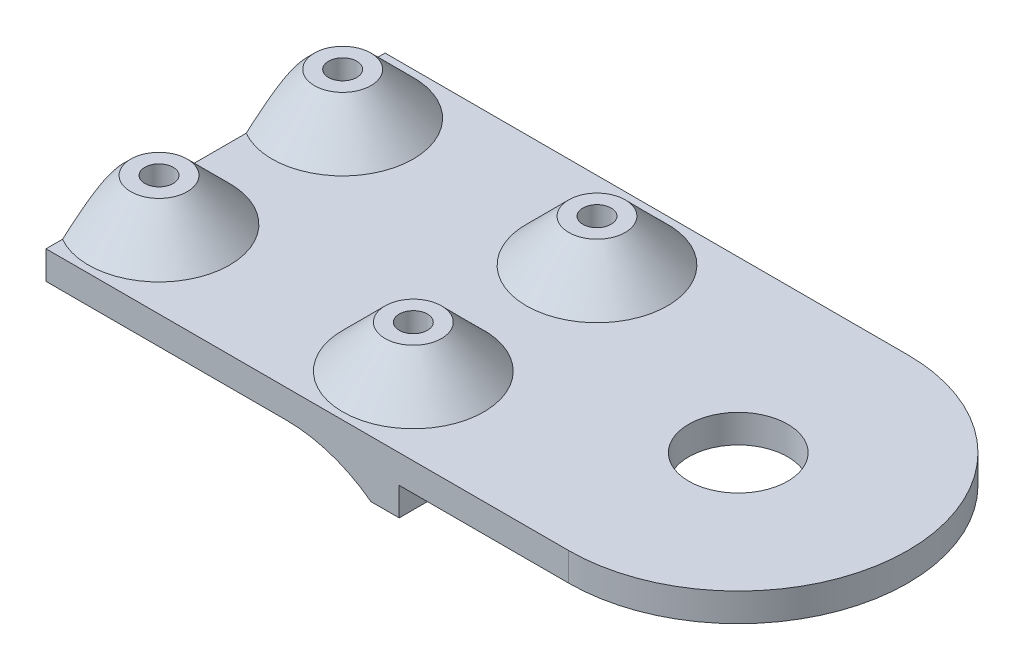
ISO-10303-21;
HEADER;
FILE_DESCRIPTION(('STEP AP214'),'2;1');
FILE_NAME('part.step','',(''),(''),'','','');
FILE_SCHEMA(('AUTOMOTIVE_DESIGN { 1 0 10303 214 1 1 1 1 }'));
ENDSEC;
DATA;
#1=APPLICATION_CONTEXT('core data for automotive mechanical design processes');
#2=APPLICATION_PROTOCOL_DEFINITION('international standard','automotive_design',2000,#1);
#3=PRODUCT_CONTEXT('',#1,'mechanical');
#4=PRODUCT('Part','Part','',(#3));
#5=PRODUCT_RELATED_PRODUCT_CATEGORY('part','',(#4));
#6=PRODUCT_DEFINITION_FORMATION('','',#4);
#7=PRODUCT_DEFINITION_CONTEXT('part definition',#1,'design');
#8=PRODUCT_DEFINITION('design','',#6,#7);
#9=PRODUCT_DEFINITION_SHAPE('','',#8);
#10=(LENGTH_UNIT() NAMED_UNIT(*) SI_UNIT(.MILLI.,.METRE.));
#11=(NAMED_UNIT(*) PLANE_ANGLE_UNIT() SI_UNIT($,.RADIAN.));
#12=(NAMED_UNIT(*) SI_UNIT($,.STERADIAN.) SOLID_ANGLE_UNIT());
#13=UNCERTAINTY_MEASURE_WITH_UNIT(LENGTH_MEASURE(1.E-05),#10,'distance_accuracy_value','');
#14=(GEOMETRIC_REPRESENTATION_CONTEXT(3) GLOBAL_UNCERTAINTY_ASSIGNED_CONTEXT((#13)) GLOBAL_UNIT_ASSIGNED_CONTEXT((#10,
#11,#12)) REPRESENTATION_CONTEXT('',''));
#15=CARTESIAN_POINT('',(0.,0.,0.));
#16=DIRECTION('',(0.,0.,1.));
#17=DIRECTION('',(1.,0.,0.));
#18=AXIS2_PLACEMENT_3D('',#15,#16,#17);
#19=CARTESIAN_POINT('',(0.,0.,0.));
#20=DIRECTION('',(0.,1.,0.));
#21=DIRECTION('',(0.,0.,1.));
#22=AXIS2_PLACEMENT_3D('',#19,#20,#21);
#23=PLANE('',#22);
#24=CARTESIAN_POINT('',(37.,0.,-12.));
#25=DIRECTION('',(0.,1.,0.));
#26=DIRECTION('',(0.,0.,1.));
#27=AXIS2_PLACEMENT_3D('',#24,#25,#26);
#28=CIRCLE('',#27,3.5);
#29=CARTESIAN_POINT('',(37.,0.,-8.5));
#30=VERTEX_POINT('',#29);
#31=EDGE_CURVE('E184',#30,#30,#28,.T.);
#32=ORIENTED_EDGE('',*,*,#31,.T.);
#33=EDGE_LOOP('',(#32));
#34=FACE_BOUND('',#33,.T.);
#35=DIRECTION('',(0.,0.,1.));
#36=VECTOR('',#35,1.);
#37=CARTESIAN_POINT('',(25.,0.,0.));
#38=LINE('',#37,#36);
#39=CARTESIAN_POINT('',(25.,0.,-24.));
#40=VERTEX_POINT('',#39);
#41=CARTESIAN_POINT('',(25.,0.,0.));
#42=VERTEX_POINT('',#41);
#43=EDGE_CURVE('E141',#40,#42,#38,.T.);
#44=ORIENTED_EDGE('',*,*,#43,.F.);
#45=DIRECTION('',(1.,0.,0.));
#46=VECTOR('',#45,1.);
#47=CARTESIAN_POINT('',(0.,0.,-24.));
#48=LINE('',#47,#46);
#49=CARTESIAN_POINT('',(37.,0.,-24.));
#50=VERTEX_POINT('',#49);
#51=EDGE_CURVE('E132',#40,#50,#48,.T.);
#52=ORIENTED_EDGE('',*,*,#51,.T.);
#53=CARTESIAN_POINT('',(37.,0.,-12.));
#54=DIRECTION('',(0.,1.,0.));
#55=DIRECTION('',(0.,0.,1.));
#56=AXIS2_PLACEMENT_3D('',#53,#54,#55);
#57=CIRCLE('',#56,12.);
#58=CARTESIAN_POINT('',(37.,0.,0.));
#59=VERTEX_POINT('',#58);
#60=EDGE_CURVE('E200',#59,#50,#57,.T.);
#61=ORIENTED_EDGE('',*,*,#60,.F.);
#62=DIRECTION('',(1.,0.,0.));
#63=VECTOR('',#62,1.);
#64=CARTESIAN_POINT('',(0.,0.,0.));
#65=LINE('',#64,#63);
#66=EDGE_CURVE('E179',#42,#59,#65,.T.);
#67=ORIENTED_EDGE('',*,*,#66,.F.);
#68=EDGE_LOOP('',(#44,#52,#61,#67));
#69=FACE_BOUND('',#68,.T.);
#70=ADVANCED_FACE('F35',(#34,#69),#23,.F.);
#71=CARTESIAN_POINT('',(2.5,0.,-5.5));
#72=DIRECTION('',(0.,1.,0.));
#73=DIRECTION('',(0.,0.,1.));
#74=AXIS2_PLACEMENT_3D('',#71,#72,#73);
#75=CIRCLE('',#74,1.);
#76=CARTESIAN_POINT('',(2.5,0.,-4.5));
#77=VERTEX_POINT('',#76);
#78=EDGE_CURVE('E154',#77,#77,#75,.T.);
#79=ORIENTED_EDGE('',*,*,#78,.T.);
#80=EDGE_LOOP('',(#79));
#81=FACE_BOUND('',#80,.T.);
#82=CARTESIAN_POINT('',(2.5,0.,-18.5));
#83=DIRECTION('',(0.,1.,0.));
#84=DIRECTION('',(0.,0.,1.));
#85=AXIS2_PLACEMENT_3D('',#82,#83,#84);
#86=CIRCLE('',#85,1.);
#87=CARTESIAN_POINT('',(2.5,0.,-17.5));
#88=VERTEX_POINT('',#87);
#89=EDGE_CURVE('E161',#88,#88,#86,.T.);
#90=ORIENTED_EDGE('',*,*,#89,.T.);
#91=EDGE_LOOP('',(#90));
#92=FACE_BOUND('',#91,.T.);
#93=CARTESIAN_POINT('',(0.,0.,-24.));
#94=VERTEX_POINT('',#93);
#95=CARTESIAN_POINT('',(17.,0.,-24.));
#96=VERTEX_POINT('',#95);
#97=EDGE_CURVE('E203',#94,#96,#48,.T.);
#98=ORIENTED_EDGE('',*,*,#97,.T.);
#99=DIRECTION('',(0.,0.,1.));
#100=VECTOR('',#99,1.);
#101=CARTESIAN_POINT('',(17.,0.,0.));
#102=LINE('',#101,#100);
#103=CARTESIAN_POINT('',(17.,0.,0.));
#104=VERTEX_POINT('',#103);
#105=EDGE_CURVE('E62',#96,#104,#102,.T.);
#106=ORIENTED_EDGE('',*,*,#105,.T.);
#107=CARTESIAN_POINT('',(0.,0.,0.));
#108=VERTEX_POINT('',#107);
#109=EDGE_CURVE('E198',#108,#104,#65,.T.);
#110=ORIENTED_EDGE('',*,*,#109,.F.);
#111=DIRECTION('',(0.,0.,-1.));
#112=VECTOR('',#111,1.);
#113=CARTESIAN_POINT('',(0.,0.,0.));
#114=LINE('',#113,#112);
#115=EDGE_CURVE('E205',#108,#94,#114,.T.);
#116=ORIENTED_EDGE('',*,*,#115,.T.);
#117=EDGE_LOOP('',(#98,#106,#110,#116));
#118=FACE_BOUND('',#117,.T.);
#119=ADVANCED_FACE('F263',(#81,#92,#118),#23,.F.);
#120=CARTESIAN_POINT('',(0.,2.,0.));
#121=DIRECTION('',(0.,0.,-1.));
#122=DIRECTION('',(-1.,0.,0.));
#123=AXIS2_PLACEMENT_3D('',#120,#121,#122);
#124=PLANE('',#123);
#125=ORIENTED_EDGE('',*,*,#109,.T.);
#126=CARTESIAN_POINT('',(17.,-10.,0.));
#127=DIRECTION('',(0.,0.,-1.));
#128=DIRECTION('',(-1.,0.,0.));
#129=AXIS2_PLACEMENT_3D('',#126,#127,#128);
#130=CIRCLE('',#129,10.);
#131=CARTESIAN_POINT('',(23.,-2.,0.));
#132=VERTEX_POINT('',#131);
#133=EDGE_CURVE('E11',#104,#132,#130,.T.);
#134=ORIENTED_EDGE('',*,*,#133,.T.);
#135=DIRECTION('',(1.,0.,0.));
#136=VECTOR('',#135,1.);
#137=CARTESIAN_POINT('',(0.,-2.,0.));
#138=LINE('',#137,#136);
#139=CARTESIAN_POINT('',(25.,-2.,0.));
#140=VERTEX_POINT('',#139);
#141=EDGE_CURVE('E136',#132,#140,#138,.T.);
#142=ORIENTED_EDGE('',*,*,#141,.T.);
#143=DIRECTION('',(0.,1.,0.));
#144=VECTOR('',#143,1.);
#145=CARTESIAN_POINT('',(25.,-2.,0.));
#146=LINE('',#145,#144);
#147=EDGE_CURVE('E135',#140,#42,#146,.T.);
#148=ORIENTED_EDGE('',*,*,#147,.T.);
#149=ORIENTED_EDGE('',*,*,#66,.T.);
#150=DIRECTION('',(0.,-1.,0.));
#151=VECTOR('',#150,1.);
#152=CARTESIAN_POINT('',(37.,2.,0.));
#153=LINE('',#152,#151);
#154=CARTESIAN_POINT('',(37.,2.,0.));
#155=VERTEX_POINT('',#154);
#156=EDGE_CURVE('E215',#155,#59,#153,.T.);
#157=ORIENTED_EDGE('',*,*,#156,.F.);
#158=DIRECTION('',(1.,0.,0.));
#159=VECTOR('',#158,1.);
#160=CARTESIAN_POINT('',(0.,2.,0.));
#161=LINE('',#160,#159);
#162=CARTESIAN_POINT('',(0.,2.,0.));
#163=VERTEX_POINT('',#162);
#164=EDGE_CURVE('E180',#163,#155,#161,.T.);
#165=ORIENTED_EDGE('',*,*,#164,.F.);
#166=DIRECTION('',(0.,-1.,0.));
#167=VECTOR('',#166,1.);
#168=CARTESIAN_POINT('',(0.,2.,0.));
#169=LINE('',#168,#167);
#170=EDGE_CURVE('E197',#163,#108,#169,.T.);
#171=ORIENTED_EDGE('',*,*,#170,.T.);
#172=EDGE_LOOP('',(#125,#134,#142,#148,#149,#157,#165,#171));
#173=FACE_BOUND('',#172,.T.);
#174=ADVANCED_FACE('F259',(#173),#124,.F.);
#175=CARTESIAN_POINT('',(37.,2.,-12.));
#176=DIRECTION('',(0.,-1.,0.));
#177=DIRECTION('',(0.,0.,-1.));
#178=AXIS2_PLACEMENT_3D('',#175,#176,#177);
#179=CYLINDRICAL_SURFACE('',#178,12.);
#180=ORIENTED_EDGE('',*,*,#60,.T.);
#181=DIRECTION('',(0.,-1.,0.));
#182=VECTOR('',#181,1.);
#183=CARTESIAN_POINT('',(37.,2.,-24.));
#184=LINE('',#183,#182);
#185=CARTESIAN_POINT('',(37.,2.,-24.));
#186=VERTEX_POINT('',#185);
#187=EDGE_CURVE('E213',#186,#50,#184,.T.);
#188=ORIENTED_EDGE('',*,*,#187,.F.);
#189=CARTESIAN_POINT('',(37.,2.,-12.));
#190=DIRECTION('',(0.,1.,0.));
#191=DIRECTION('',(0.,0.,1.));
#192=AXIS2_PLACEMENT_3D('',#189,#190,#191);
#193=CIRCLE('',#192,12.);
#194=EDGE_CURVE('E183',#155,#186,#193,.T.);
#195=ORIENTED_EDGE('',*,*,#194,.F.);
#196=ORIENTED_EDGE('',*,*,#156,.T.);
#197=EDGE_LOOP('',(#180,#188,#195,#196));
#198=FACE_BOUND('',#197,.T.);
#199=ADVANCED_FACE('F256',(#198),#179,.T.);
#200=CARTESIAN_POINT('',(0.,2.,-24.));
#201=DIRECTION('',(0.,0.,-1.));
#202=DIRECTION('',(-1.,0.,0.));
#203=AXIS2_PLACEMENT_3D('',#200,#201,#202);
#204=PLANE('',#203);
#205=ORIENTED_EDGE('',*,*,#97,.F.);
#206=DIRECTION('',(0.,-1.,0.));
#207=VECTOR('',#206,1.);
#208=CARTESIAN_POINT('',(0.,2.,-24.));
#209=LINE('',#208,#207);
#210=CARTESIAN_POINT('',(0.,2.,-24.));
#211=VERTEX_POINT('',#210);
#212=EDGE_CURVE('E211',#211,#94,#209,.T.);
#213=ORIENTED_EDGE('',*,*,#212,.F.);
#214=DIRECTION('',(1.,0.,0.));
#215=VECTOR('',#214,1.);
#216=CARTESIAN_POINT('',(0.,2.,-24.));
#217=LINE('',#216,#215);
#218=EDGE_CURVE('E186',#211,#186,#217,.T.);
#219=ORIENTED_EDGE('',*,*,#218,.T.);
#220=ORIENTED_EDGE('',*,*,#187,.T.);
#221=ORIENTED_EDGE('',*,*,#51,.F.);
#222=DIRECTION('',(0.,1.,0.));
#223=VECTOR('',#222,1.);
#224=CARTESIAN_POINT('',(25.,-2.,-24.));
#225=LINE('',#224,#223);
#226=CARTESIAN_POINT('',(25.,-2.,-24.));
#227=VERTEX_POINT('',#226);
#228=EDGE_CURVE('E129',#227,#40,#225,.T.);
#229=ORIENTED_EDGE('',*,*,#228,.F.);
#230=DIRECTION('',(1.,0.,0.));
#231=VECTOR('',#230,1.);
#232=CARTESIAN_POINT('',(0.,-2.,-24.));
#233=LINE('',#232,#231);
#234=CARTESIAN_POINT('',(23.,-2.,-24.));
#235=VERTEX_POINT('',#234);
#236=EDGE_CURVE('E117',#235,#227,#233,.T.);
#237=ORIENTED_EDGE('',*,*,#236,.F.);
#238=CARTESIAN_POINT('',(17.,-10.,-24.));
#239=DIRECTION('',(0.,0.,-1.));
#240=DIRECTION('',(-1.,0.,0.));
#241=AXIS2_PLACEMENT_3D('',#238,#239,#240);
#242=CIRCLE('',#241,10.);
#243=EDGE_CURVE('E48',#235,#96,#242,.F.);
#244=ORIENTED_EDGE('',*,*,#243,.T.);
#245=EDGE_LOOP('',(#205,#213,#219,#220,#221,#229,#237,#244));
#246=FACE_BOUND('',#245,.T.);
#247=ADVANCED_FACE('F130',(#246),#204,.T.);
#248=CARTESIAN_POINT('',(0.,2.,0.));
#249=DIRECTION('',(-1.,0.,0.));
#250=DIRECTION('',(0.,0.,1.));
#251=AXIS2_PLACEMENT_3D('',#248,#249,#250);
#252=PLANE('',#251);
#253=ORIENTED_EDGE('',*,*,#115,.F.);
#254=ORIENTED_EDGE('',*,*,#170,.F.);
#255=DIRECTION('',(0.,0.,-1.));
#256=VECTOR('',#255,1.);
#257=CARTESIAN_POINT('',(0.,2.,0.));
#258=LINE('',#257,#256);
#259=CARTESIAN_POINT('',(0.,2.,-1.16987298107782));
#260=VERTEX_POINT('',#259);
#261=EDGE_CURVE('E190',#163,#260,#258,.T.);
#262=ORIENTED_EDGE('',*,*,#261,.T.);
#263=CARTESIAN_POINT('',(0.,2.,-1.16987298107782));
#264=CARTESIAN_POINT('',(0.,2.11102028561748,-1.29811896667083));
#265=CARTESIAN_POINT('',(0.,2.22138964449108,-1.42694043064441));
#266=CARTESIAN_POINT('',(0.,2.44036248190678,-1.68617973891037));
#267=CARTESIAN_POINT('',(0.,2.54896508599943,-1.81659832088444));
#268=CARTESIAN_POINT('',(0.,2.76635278332313,-2.08243653223856));
#269=CARTESIAN_POINT('',(0.,2.87508239787838,-2.21790171021895));
#270=CARTESIAN_POINT('',(0.,3.08919780990352,-2.49140734337877));
#271=CARTESIAN_POINT('',(0.,3.19458444119692,-2.6294471425238));
#272=CARTESIAN_POINT('',(0.,3.40089119784645,-2.909144515227));
#273=CARTESIAN_POINT('',(0.,3.50180489898433,-3.05080685904445));
#274=CARTESIAN_POINT('',(0.,3.69705465616297,-3.3388231556635));
#275=CARTESIAN_POINT('',(0.,3.79138529437451,-3.48518083142675));
#276=CARTESIAN_POINT('',(0.,3.96935859054866,-3.78275310980562));
#277=CARTESIAN_POINT('',(0.,4.0530804150461,-3.93391972527803));
#278=CARTESIAN_POINT('',(0.,4.20533486796254,-4.2437062238995));
#279=CARTESIAN_POINT('',(0.,4.27389569332966,-4.40231159450449));
#280=CARTESIAN_POINT('',(0.,4.3600347555185,-4.64825485294383));
#281=CARTESIAN_POINT('',(0.,4.38616221249707,-4.73258498035122));
#282=CARTESIAN_POINT('',(0.,4.43107085398967,-4.9032034930822));
#283=CARTESIAN_POINT('',(0.,4.44985321239967,-4.98949156315259));
#284=CARTESIAN_POINT('',(0.,4.47882728150846,-5.1629932917334));
#285=CARTESIAN_POINT('',(0.,4.48906979592931,-5.25019830534053));
#286=CARTESIAN_POINT('',(0.,4.50040506767032,-5.42520634082983));
#287=CARTESIAN_POINT('',(0.,4.50149870727723,-5.51300930423039));
#288=CARTESIAN_POINT('',(0.,4.49444971956765,-5.68831669792562));
#289=CARTESIAN_POINT('',(0.,4.48629853638581,-5.77582077638265));
#290=CARTESIAN_POINT('',(0.,4.46135496560027,-5.94957920981623));
#291=CARTESIAN_POINT('',(0.,4.44456091030227,-6.03583332030022));
#292=CARTESIAN_POINT('',(0.,4.40327077533189,-6.20708212278415));
#293=CARTESIAN_POINT('',(0.,4.3787218150578,-6.29206384192981));
#294=CARTESIAN_POINT('',(0.,4.32323053630725,-6.45988047510072));
#295=CARTESIAN_POINT('',(0.,4.29228818622622,-6.54271537851131));
#296=CARTESIAN_POINT('',(0.,4.21730185412421,-6.72552506872367));
#297=CARTESIAN_POINT('',(0.,4.17188908182162,-6.82493378735351));
#298=CARTESIAN_POINT('',(0.,4.07501498236769,-7.02078454937138));
#299=CARTESIAN_POINT('',(0.,4.02355013559929,-7.11722482490347));
#300=CARTESIAN_POINT('',(0.,3.9159189083616,-7.30768911371251));
#301=CARTESIAN_POINT('',(0.,3.85974294629128,-7.40170766818144));
#302=CARTESIAN_POINT('',(0.,3.74386597285785,-7.58750514409051));
#303=CARTESIAN_POINT('',(0.,3.68416566836026,-7.67928450945359));
#304=CARTESIAN_POINT('',(0.,3.56169555881191,-7.86146330213527));
#305=CARTESIAN_POINT('',(0.,3.49891129228361,-7.95185296269885));
#306=CARTESIAN_POINT('',(0.,3.37114498929469,-8.13106917191764));
#307=CARTESIAN_POINT('',(0.,3.30616278739215,-8.21989560213764));
#308=CARTESIAN_POINT('',(0.,3.10876538092659,-8.48420956576962));
#309=CARTESIAN_POINT('',(0.,2.9737482833352,-8.65775166574288));
#310=CARTESIAN_POINT('',(0.,2.6999574315782,-9.00011418577498));
#311=CARTESIAN_POINT('',(0.,2.56121091552945,-9.1689566084475));
#312=CARTESIAN_POINT('',(0.,2.35143188412874,-9.41933882445618));
#313=CARTESIAN_POINT('',(0.,2.28160219893462,-9.50189066161007));
#314=CARTESIAN_POINT('',(0.,2.14127527268499,-9.66641858358468));
#315=CARTESIAN_POINT('',(0.,2.07077806295171,-9.74839469510887));
#316=CARTESIAN_POINT('',(0.,2.,-9.83012701892218));
#317=B_SPLINE_CURVE_WITH_KNOTS('',3,(#263,#264,#265,#266,#267,#268,#269,#270,#271,#272,#273,
#274,#275,#276,#277,#278,#279,#280,#281,#282,#283,#284,#285,#286,#287,#288,#289,#290,#291,#292,
#293,#294,#295,#296,#297,#298,#299,#300,#301,#302,#303,#304,#305,#306,#307,#308,#309,#310,#311,
#312,#313,#314,#315,#316),.UNSPECIFIED.,.F.,.F.,(4,2,2,2,2,2,2,2,2,2,2,2,2,2,2,2,2,2,2,2,2,2,2,
2,2,2,4),(0.,0.508885434217438,1.01801551343181,1.53908854922306,2.06003057777813,
2.58169804635765,3.10378990164052,3.62172208893059,4.13868275156297,4.4032714931494,
4.66781793078105,4.93077911369279,5.1937149372192,5.45689430035165,5.72012446458051,
5.98518981404701,6.25025647384739,6.57784876893184,6.90563252813838,7.23409990879746,
7.56250163221759,7.89262640121295,8.2227760747411,8.88227568038159,9.53783822739043,
9.86220984561988,10.1865663180574),.UNSPECIFIED.);
#318=CARTESIAN_POINT('',(0.,2.,-9.83012701892218));
#319=VERTEX_POINT('',#318);
#320=EDGE_CURVE('E230',#260,#319,#317,.T.);
#321=ORIENTED_EDGE('',*,*,#320,.T.);
#322=CARTESIAN_POINT('',(0.,2.,-14.1698729810778));
#323=VERTEX_POINT('',#322);
#324=EDGE_CURVE('E194',#319,#323,#258,.T.);
#325=ORIENTED_EDGE('',*,*,#324,.T.);
#326=CARTESIAN_POINT('',(0.,2.,-14.1698729810778));
#327=CARTESIAN_POINT('',(0.,2.11102028561748,-14.2981189666708));
#328=CARTESIAN_POINT('',(0.,2.22138964449108,-14.4269404306444));
#329=CARTESIAN_POINT('',(0.,2.44036248190677,-14.6861797389104));
#330=CARTESIAN_POINT('',(0.,2.54896508599943,-14.8165983208844));
#331=CARTESIAN_POINT('',(0.,2.76635278332313,-15.0824365322386));
#332=CARTESIAN_POINT('',(0.,2.87508239787837,-15.217901710219));
#333=CARTESIAN_POINT('',(0.,3.08919780990352,-15.4914073433788));
#334=CARTESIAN_POINT('',(0.,3.19458444119692,-15.6294471425238));
#335=CARTESIAN_POINT('',(0.,3.40089119784644,-15.909144515227));
#336=CARTESIAN_POINT('',(0.,3.50180489898432,-16.0508068590445));
#337=CARTESIAN_POINT('',(0.,3.69705465616296,-16.3388231556635));
#338=CARTESIAN_POINT('',(0.,3.7913852943745,-16.4851808314268));
#339=CARTESIAN_POINT('',(0.,3.96935859054865,-16.7827531098056));
#340=CARTESIAN_POINT('',(0.,4.05308041504609,-16.933919725278));
#341=CARTESIAN_POINT('',(0.,4.20533486796253,-17.2437062238995));
#342=CARTESIAN_POINT('',(0.,4.27389569332965,-17.4023115945045));
#343=CARTESIAN_POINT('',(0.,4.36003475551848,-17.6482548529438));
#344=CARTESIAN_POINT('',(0.,4.38616221249706,-17.7325849803512));
#345=CARTESIAN_POINT('',(0.,4.43107085398966,-17.9032034930822));
#346=CARTESIAN_POINT('',(0.,4.44985321239966,-17.9894915631526));
#347=CARTESIAN_POINT('',(0.,4.47882728150845,-18.1629932917334));
#348=CARTESIAN_POINT('',(0.,4.48906979592931,-18.2501983053405));
#349=CARTESIAN_POINT('',(0.,4.50040506767032,-18.4252063408298));
#350=CARTESIAN_POINT('',(0.,4.50149870727722,-18.5130093042304));
#351=CARTESIAN_POINT('',(0.,4.49444971956764,-18.6883166979256));
#352=CARTESIAN_POINT('',(0.,4.4862985363858,-18.7758207763826));
#353=CARTESIAN_POINT('',(0.,4.46135496560027,-18.9495792098162));
#354=CARTESIAN_POINT('',(0.,4.44456091030226,-19.0358333203002));
#355=CARTESIAN_POINT('',(0.,4.40327077533188,-19.2070821227842));
#356=CARTESIAN_POINT('',(0.,4.37872181505779,-19.2920638419298));
#357=CARTESIAN_POINT('',(0.,4.32323053630724,-19.4598804751007));
#358=CARTESIAN_POINT('',(0.,4.29228818622621,-19.5427153785113));
#359=CARTESIAN_POINT('',(0.,4.2173018541242,-19.7255250687237));
#360=CARTESIAN_POINT('',(0.,4.17188908182162,-19.8249337873535));
#361=CARTESIAN_POINT('',(0.,4.07501498236768,-20.0207845493714));
#362=CARTESIAN_POINT('',(0.,4.02355013559929,-20.1172248249035));
#363=CARTESIAN_POINT('',(0.,3.91591890836159,-20.3076891137125));
#364=CARTESIAN_POINT('',(0.,3.85974294629128,-20.4017076681814));
#365=CARTESIAN_POINT('',(0.,3.74386597285784,-20.5875051440905));
#366=CARTESIAN_POINT('',(0.,3.68416566836025,-20.6792845094536));
#367=CARTESIAN_POINT('',(0.,3.5616955588119,-20.8614633021353));
#368=CARTESIAN_POINT('',(0.,3.4989112922836,-20.9518529626988));
#369=CARTESIAN_POINT('',(0.,3.37114498929468,-21.1310691719176));
#370=CARTESIAN_POINT('',(0.,3.30616278739215,-21.2198956021376));
#371=CARTESIAN_POINT('',(0.,3.10876538092659,-21.4842095657696));
#372=CARTESIAN_POINT('',(0.,2.9737482833352,-21.6577516657429));
#373=CARTESIAN_POINT('',(0.,2.6999574315782,-22.000114185775));
#374=CARTESIAN_POINT('',(0.,2.56121091552946,-22.1689566084475));
#375=CARTESIAN_POINT('',(0.,2.35143188412874,-22.4193388244562));
#376=CARTESIAN_POINT('',(0.,2.28160219893462,-22.5018906616101));
#377=CARTESIAN_POINT('',(0.,2.14127527268499,-22.6664185835847));
#378=CARTESIAN_POINT('',(0.,2.07077806295171,-22.7483946951088));
#379=CARTESIAN_POINT('',(0.,2.,-22.8301270189222));
#380=B_SPLINE_CURVE_WITH_KNOTS('',3,(#326,#327,#328,#329,#330,#331,#332,#333,#334,#335,#336,
#337,#338,#339,#340,#341,#342,#343,#344,#345,#346,#347,#348,#349,#350,#351,#352,#353,#354,#355,
#356,#357,#358,#359,#360,#361,#362,#363,#364,#365,#366,#367,#368,#369,#370,#371,#372,#373,#374,
#375,#376,#377,#378,#379),.UNSPECIFIED.,.F.,.F.,(4,2,2,2,2,2,2,2,2,2,2,2,2,2,2,2,2,2,2,2,2,2,2,
2,2,2,4),(0.,0.508885434217435,1.01801551343181,1.53908854922306,2.06003057777812,
2.58169804635764,3.10378990164051,3.62172208893057,4.13868275156295,4.40327149314937,
4.66781793078103,4.93077911369277,5.19371493721918,5.45689430035163,5.72012446458049,
5.98518981404699,6.25025647384736,6.57784876893181,6.90563252813835,7.23409990879743,
7.56250163221756,7.89262640121292,8.22277607474107,8.88227568038155,9.5378382273904,
9.86220984561984,10.1865663180574),.UNSPECIFIED.);
#381=CARTESIAN_POINT('',(0.,2.,-22.8301270189222));
#382=VERTEX_POINT('',#381);
#383=EDGE_CURVE('E237',#323,#382,#380,.T.);
#384=ORIENTED_EDGE('',*,*,#383,.T.);
#385=EDGE_CURVE('E189',#382,#211,#258,.T.);
#386=ORIENTED_EDGE('',*,*,#385,.T.);
#387=ORIENTED_EDGE('',*,*,#212,.T.);
#388=EDGE_LOOP('',(#253,#254,#262,#321,#325,#384,#386,#387));
#389=FACE_BOUND('',#388,.T.);
#390=ADVANCED_FACE('F245',(#389),#252,.T.);
#391=CARTESIAN_POINT('',(37.,2.,-12.));
#392=DIRECTION('',(0.,-1.,0.));
#393=DIRECTION('',(0.,0.,-1.));
#394=AXIS2_PLACEMENT_3D('',#391,#392,#393);
#395=CYLINDRICAL_SURFACE('',#394,3.5);
#396=CARTESIAN_POINT('',(37.,2.,-12.));
#397=DIRECTION('',(0.,1.,0.));
#398=DIRECTION('',(0.,0.,1.));
#399=AXIS2_PLACEMENT_3D('',#396,#397,#398);
#400=CIRCLE('',#399,3.5);
#401=CARTESIAN_POINT('',(37.,2.,-8.5));
#402=VERTEX_POINT('',#401);
#403=EDGE_CURVE('E193',#402,#402,#400,.T.);
#404=ORIENTED_EDGE('',*,*,#403,.T.);
#405=EDGE_LOOP('',(#404));
#406=FACE_BOUND('',#405,.T.);
#407=ORIENTED_EDGE('',*,*,#31,.F.);
#408=EDGE_LOOP('',(#407));
#409=FACE_BOUND('',#408,.T.);
#410=ADVANCED_FACE('F250',(#406,#409),#395,.F.);
#411=CARTESIAN_POINT('',(0.,2.,0.));
#412=DIRECTION('',(0.,1.,0.));
#413=DIRECTION('',(0.,0.,1.));
#414=AXIS2_PLACEMENT_3D('',#411,#412,#413);
#415=PLANE('',#414);
#416=CARTESIAN_POINT('',(20.5,2.,-5.5));
#417=DIRECTION('',(0.,1.,0.));
#418=DIRECTION('',(0.,0.,1.));
#419=AXIS2_PLACEMENT_3D('',#416,#417,#418);
#420=CIRCLE('',#419,4.99999999999999);
#421=CARTESIAN_POINT('',(20.5,2.,-0.500000000000009));
#422=VERTEX_POINT('',#421);
#423=EDGE_CURVE('E227',#422,#422,#420,.F.);
#424=ORIENTED_EDGE('',*,*,#423,.T.);
#425=EDGE_LOOP('',(#424));
#426=FACE_BOUND('',#425,.T.);
#427=CARTESIAN_POINT('',(20.5,2.,-18.5));
#428=DIRECTION('',(0.,1.,0.));
#429=DIRECTION('',(0.,0.,1.));
#430=AXIS2_PLACEMENT_3D('',#427,#428,#429);
#431=CIRCLE('',#430,4.99999999999997);
#432=CARTESIAN_POINT('',(20.5,2.,-13.5));
#433=VERTEX_POINT('',#432);
#434=EDGE_CURVE('E224',#433,#433,#431,.F.);
#435=ORIENTED_EDGE('',*,*,#434,.T.);
#436=EDGE_LOOP('',(#435));
#437=FACE_BOUND('',#436,.T.);
#438=ORIENTED_EDGE('',*,*,#324,.F.);
#439=CARTESIAN_POINT('',(2.5,2.,-5.5));
#440=DIRECTION('',(0.,1.,0.));
#441=DIRECTION('',(0.,0.,1.));
#442=AXIS2_PLACEMENT_3D('',#439,#440,#441);
#443=CIRCLE('',#442,4.99999999999999);
#444=EDGE_CURVE('E221',#319,#260,#443,.F.);
#445=ORIENTED_EDGE('',*,*,#444,.T.);
#446=ORIENTED_EDGE('',*,*,#261,.F.);
#447=ORIENTED_EDGE('',*,*,#164,.T.);
#448=ORIENTED_EDGE('',*,*,#194,.T.);
#449=ORIENTED_EDGE('',*,*,#218,.F.);
#450=ORIENTED_EDGE('',*,*,#385,.F.);
#451=CARTESIAN_POINT('',(2.5,2.,-18.5));
#452=DIRECTION('',(0.,1.,0.));
#453=DIRECTION('',(0.,0.,1.));
#454=AXIS2_PLACEMENT_3D('',#451,#452,#453);
#455=CIRCLE('',#454,4.99999999999998);
#456=EDGE_CURVE('E218',#382,#323,#455,.F.);
#457=ORIENTED_EDGE('',*,*,#456,.T.);
#458=EDGE_LOOP('',(#438,#445,#446,#447,#448,#449,#450,#457));
#459=FACE_BOUND('',#458,.T.);
#460=ORIENTED_EDGE('',*,*,#403,.F.);
#461=EDGE_LOOP('',(#460));
#462=FACE_BOUND('',#461,.T.);
#463=ADVANCED_FACE('F286',(#426,#437,#459,#462),#415,.T.);
#464=CARTESIAN_POINT('',(20.5,5.,-18.5));
#465=DIRECTION('',(0.,-1.,0.));
#466=DIRECTION('',(0.,0.,-1.));
#467=AXIS2_PLACEMENT_3D('',#464,#465,#466);
#468=CYLINDRICAL_SURFACE('',#467,0.999999999999998);
#469=CARTESIAN_POINT('',(20.5,5.,-18.5));
#470=DIRECTION('',(0.,1.,0.));
#471=DIRECTION('',(0.,0.,1.));
#472=AXIS2_PLACEMENT_3D('',#469,#470,#471);
#473=CIRCLE('',#472,0.999999999999998);
#474=CARTESIAN_POINT('',(20.5,5.,-17.5));
#475=VERTEX_POINT('',#474);
#476=EDGE_CURVE('E176',#475,#475,#473,.F.);
#477=ORIENTED_EDGE('',*,*,#476,.F.);
#478=EDGE_LOOP('',(#477));
#479=FACE_BOUND('',#478,.T.);
#480=CARTESIAN_POINT('',(20.3066315143389,-0.562511561417384,-19.4811262042944));
#481=CARTESIAN_POINT('',(20.365742530409,-0.583223445278062,-19.4927735091349));
#482=CARTESIAN_POINT('',(20.4256599629851,-0.604846606867455,-19.4990185448949));
#483=CARTESIAN_POINT('',(20.545265450507,-0.649321885068509,-19.5007701196051));
#484=CARTESIAN_POINT('',(20.6049529058517,-0.672176124523858,-19.4962574886096));
#485=CARTESIAN_POINT('',(20.7222848809626,-0.718375027305432,-19.4767897603745));
#486=CARTESIAN_POINT('',(20.7799327372686,-0.741718779716711,-19.4618526333718));
#487=CARTESIAN_POINT('',(20.8917493521821,-0.788162273251515,-19.4219847190688));
#488=CARTESIAN_POINT('',(20.9459189338226,-0.811262071010925,-19.3970563061028));
#489=CARTESIAN_POINT('',(21.0501346172711,-0.856713261480672,-19.3372672433165));
#490=CARTESIAN_POINT('',(21.1001031847125,-0.879047351093711,-19.3022576772296));
#491=CARTESIAN_POINT('',(21.1933745656353,-0.921550823453421,-19.2231653164521));
#492=CARTESIAN_POINT('',(21.2366777304106,-0.941720320265972,-19.1790830002186));
#493=CARTESIAN_POINT('',(21.3132044652758,-0.977916915399299,-19.0849869658334));
#494=CARTESIAN_POINT('',(21.346792141816,-0.994088905662363,-19.0353265765911));
#495=CARTESIAN_POINT('',(21.404875194337,-1.0223541926931,-18.9298995922455));
#496=CARTESIAN_POINT('',(21.4293783796421,-1.03445099180671,-18.8741382953424));
#497=CARTESIAN_POINT('',(21.4660675764881,-1.0526752776327,-18.7640787363627));
#498=CARTESIAN_POINT('',(21.4792361316799,-1.0592767449572,-18.7101863999591));
#499=CARTESIAN_POINT('',(21.4964665260599,-1.06792935381067,-18.600617420358));
#500=CARTESIAN_POINT('',(21.5005339860433,-1.06998330385751,-18.544941900012));
#501=CARTESIAN_POINT('',(21.4994013812987,-1.06941300993102,-18.4383501630104));
#502=CARTESIAN_POINT('',(21.4949417146408,-1.06716250976872,-18.3874220633464));
#503=CARTESIAN_POINT('',(21.4784041165536,-1.05886018786671,-18.2871455618337));
#504=CARTESIAN_POINT('',(21.466326525499,-1.05280853596545,-18.2377970895095));
#505=CARTESIAN_POINT('',(21.4351150845135,-1.03729650953129,-18.1421062961694));
#506=CARTESIAN_POINT('',(21.4159984553258,-1.02784445524183,-18.0957569605473));
#507=CARTESIAN_POINT('',(21.3714262383548,-1.00604391052617,-18.0069621662582));
#508=CARTESIAN_POINT('',(21.3459690378509,-0.993694683252222,-17.9645177045606));
#509=CARTESIAN_POINT('',(21.28747251667,-0.965693031749046,-17.8814106806558));
#510=CARTESIAN_POINT('',(21.2540173765936,-0.94986606548591,-17.8411002521142));
#511=CARTESIAN_POINT('',(21.1817469018804,-0.916246291813256,-17.7665704265812));
#512=CARTESIAN_POINT('',(21.142929358104,-0.898452674813372,-17.7323535533084));
#513=CARTESIAN_POINT('',(21.0568898849955,-0.859755122667062,-17.6675030978615));
#514=CARTESIAN_POINT('',(21.0092173515389,-0.838717163805063,-17.6375464687837));
#515=CARTESIAN_POINT('',(20.9098169790291,-0.79585620699063,-17.5861157533452));
#516=CARTESIAN_POINT('',(20.858087605325,-0.774032913661966,-17.5646448957743));
#517=CARTESIAN_POINT('',(20.74819361194,-0.728818646691825,-17.52945974054));
#518=CARTESIAN_POINT('',(20.6898304491223,-0.70542164198764,-17.5163695714589));
#519=CARTESIAN_POINT('',(20.5714403552622,-0.659290694403372,-17.5007694735126));
#520=CARTESIAN_POINT('',(20.5114132351336,-0.636556827487286,-17.4982607520873));
#521=CARTESIAN_POINT('',(20.390972545871,-0.592266579307874,-17.5041227648075));
#522=CARTESIAN_POINT('',(20.3305591265432,-0.570719263091831,-17.5125676461296));
#523=CARTESIAN_POINT('',(20.2116567662005,-0.529560865612177,-17.5405287320753));
#524=CARTESIAN_POINT('',(20.1531673869512,-0.509949341372896,-17.5600423968535));
#525=CARTESIAN_POINT('',(20.0425289888279,-0.473916661783806,-17.6088097668027));
#526=CARTESIAN_POINT('',(19.9902167040677,-0.457395947351923,-17.637618798894));
#527=CARTESIAN_POINT('',(19.8910737686444,-0.426892651345488,-17.7045244534146));
#528=CARTESIAN_POINT('',(19.8442413110457,-0.412909232272712,-17.7426180014918));
#529=CARTESIAN_POINT('',(19.7601973911546,-0.388385809282471,-17.8247552783063));
#530=CARTESIAN_POINT('',(19.7226006071986,-0.377699638842163,-17.8683613924235));
#531=CARTESIAN_POINT('',(19.6552521890694,-0.358897253030299,-17.9617503861552));
#532=CARTESIAN_POINT('',(19.6254986236733,-0.350780404919631,-18.0115317408022));
#533=CARTESIAN_POINT('',(19.5759709527494,-0.337443004205809,-18.1136575854948));
#534=CARTESIAN_POINT('',(19.5558409195857,-0.332118298830772,-18.1658161238921));
#535=CARTESIAN_POINT('',(19.5245241549662,-0.323893210809348,-18.2729337060846));
#536=CARTESIAN_POINT('',(19.5133362065361,-0.320992498266883,-18.3278923677133));
#537=CARTESIAN_POINT('',(19.5004357133252,-0.317651889442238,-18.4378014788665));
#538=CARTESIAN_POINT('',(19.4985279888596,-0.317161301715413,-18.4927275745331));
#539=CARTESIAN_POINT('',(19.5037223736313,-0.318503147685173,-18.6021217052938));
#540=CARTESIAN_POINT('',(19.510824001067,-0.320335457157996,-18.6565897647259));
#541=CARTESIAN_POINT('',(19.5337326082595,-0.326306988133901,-18.7632211796179));
#542=CARTESIAN_POINT('',(19.5494925930718,-0.330433757444245,-18.8153953489527));
#543=CARTESIAN_POINT('',(19.5891564565046,-0.340978970009637,-18.9162962796408));
#544=CARTESIAN_POINT('',(19.6130600327213,-0.34739732816934,-18.9650231689242));
#545=CARTESIAN_POINT('',(19.6684456492606,-0.362561258418502,-19.0580982653772));
#546=CARTESIAN_POINT('',(19.69998715572,-0.371325151285997,-19.1024080604218));
#547=CARTESIAN_POINT('',(19.7695253607716,-0.391096185313416,-19.1850732261716));
#548=CARTESIAN_POINT('',(19.8075241414676,-0.402104050255968,-19.2234266686333));
#549=CARTESIAN_POINT('',(19.8897491461184,-0.42653506932205,-19.2941058047021));
#550=CARTESIAN_POINT('',(19.934102672579,-0.440009734679037,-19.3262652207448));
#551=CARTESIAN_POINT('',(20.0269156800523,-0.468990809526144,-19.3826868391079));
#552=CARTESIAN_POINT('',(20.0753710548063,-0.484495195417384,-19.4069568242143));
#553=CARTESIAN_POINT('',(20.1546417953909,-0.510574127956593,-19.4390107979057));
#554=CARTESIAN_POINT('',(20.1845896095044,-0.520579620617225,-19.449481206357));
#555=CARTESIAN_POINT('',(20.2451622825778,-0.54114457068117,-19.4675000391006));
#556=CARTESIAN_POINT('',(20.2757871128893,-0.55170400466991,-19.4750485867843));
#557=CARTESIAN_POINT('',(20.3066315143389,-0.562511561417384,-19.4811262042944));
#558=B_SPLINE_CURVE_WITH_KNOTS('',3,(#480,#481,#482,#483,#484,#485,#486,#487,#488,#489,#490,
#491,#492,#493,#494,#495,#496,#497,#498,#499,#500,#501,#502,#503,#504,#505,#506,#507,#508,#509,
#510,#511,#512,#513,#514,#515,#516,#517,#518,#519,#520,#521,#522,#523,#524,#525,#526,#527,#528,
#529,#530,#531,#532,#533,#534,#535,#536,#537,#538,#539,#540,#541,#542,#543,#544,#545,#546,#547,
#548,#549,#550,#551,#552,#553,#554,#555,#556,#557),.UNSPECIFIED.,.T.,.F.,(4,2,2,2,2,2,2,2,2,2,2,
2,2,2,2,2,2,2,2,2,2,2,2,2,2,2,2,2,2,2,2,2,2,2,2,2,2,2,4),(0.,0.190999555705837,
0.382339723122559,0.573350861477002,0.764316634736195,0.958262307442661,1.15219775491988,
1.33746203268317,1.52256667993145,1.68926404679197,1.85585843366276,2.00864072044889,
2.16141618128777,2.31382033941041,2.46626330109711,2.629755443165,2.79331514077283,
2.97285869110884,3.15247049116666,3.34425215379762,3.53605569987643,3.72916440419306,
3.92222881565985,4.10716468683693,4.29203940378759,4.46683511071514,4.64158773769097,
4.80924988637565,4.97688921317046,5.14098707391083,5.30507615940548,5.46828329399367,
5.63148436871505,5.79599940520735,5.96056758944954,6.12907536848151,6.29741640948541,
6.39708507013488,6.49674952127407),.UNSPECIFIED.);
#559=CARTESIAN_POINT('',(20.3066315143389,-0.562511561417384,-19.4811262042944));
#560=VERTEX_POINT('',#559);
#561=EDGE_CURVE('E170',#560,#560,#558,.T.);
#562=ORIENTED_EDGE('',*,*,#561,.T.);
#563=EDGE_LOOP('',(#562));
#564=FACE_BOUND('',#563,.T.);
#565=ADVANCED_FACE('F289',(#479,#564),#468,.F.);
#566=CARTESIAN_POINT('',(0.,5.,0.));
#567=DIRECTION('',(0.,1.,0.));
#568=DIRECTION('',(0.,0.,1.));
#569=AXIS2_PLACEMENT_3D('',#566,#567,#568);
#570=PLANE('',#569);
#571=CARTESIAN_POINT('',(20.5,5.,-18.5));
#572=DIRECTION('',(0.,1.,0.));
#573=DIRECTION('',(0.,0.,1.));
#574=AXIS2_PLACEMENT_3D('',#571,#572,#573);
#575=CIRCLE('',#574,2.);
#576=CARTESIAN_POINT('',(20.5,5.,-16.5));
#577=VERTEX_POINT('',#576);
#578=EDGE_CURVE('E173',#577,#577,#575,.F.);
#579=ORIENTED_EDGE('',*,*,#578,.F.);
#580=EDGE_LOOP('',(#579));
#581=FACE_BOUND('',#580,.T.);
#582=ORIENTED_EDGE('',*,*,#476,.T.);
#583=EDGE_LOOP('',(#582));
#584=FACE_BOUND('',#583,.T.);
#585=ADVANCED_FACE('F294',(#581,#584),#570,.T.);
#586=CARTESIAN_POINT('',(2.5,5.,-18.5));
#587=DIRECTION('',(0.,-1.,0.));
#588=DIRECTION('',(0.,0.,-1.));
#589=AXIS2_PLACEMENT_3D('',#586,#587,#588);
#590=CYLINDRICAL_SURFACE('',#589,1.);
#591=CARTESIAN_POINT('',(2.5,5.,-18.5));
#592=DIRECTION('',(0.,1.,0.));
#593=DIRECTION('',(0.,0.,1.));
#594=AXIS2_PLACEMENT_3D('',#591,#592,#593);
#595=CIRCLE('',#594,1.);
#596=CARTESIAN_POINT('',(2.5,5.,-17.5));
#597=VERTEX_POINT('',#596);
#598=EDGE_CURVE('E164',#597,#597,#595,.T.);
#599=ORIENTED_EDGE('',*,*,#598,.T.);
#600=EDGE_LOOP('',(#599));
#601=FACE_BOUND('',#600,.T.);
#602=ORIENTED_EDGE('',*,*,#89,.F.);
#603=EDGE_LOOP('',(#602));
#604=FACE_BOUND('',#603,.T.);
#605=ADVANCED_FACE('F318',(#601,#604),#590,.F.);
#606=CARTESIAN_POINT('',(0.,5.,0.));
#607=DIRECTION('',(0.,1.,0.));
#608=DIRECTION('',(0.,0.,1.));
#609=AXIS2_PLACEMENT_3D('',#606,#607,#608);
#610=PLANE('',#609);
#611=ORIENTED_EDGE('',*,*,#598,.F.);
#612=EDGE_LOOP('',(#611));
#613=FACE_BOUND('',#612,.T.);
#614=CARTESIAN_POINT('',(2.5,5.,-18.5));
#615=DIRECTION('',(0.,1.,0.));
#616=DIRECTION('',(0.,0.,1.));
#617=AXIS2_PLACEMENT_3D('',#614,#615,#616);
#618=CIRCLE('',#617,2.);
#619=CARTESIAN_POINT('',(2.5,5.,-16.5));
#620=VERTEX_POINT('',#619);
#621=EDGE_CURVE('E167',#620,#620,#618,.T.);
#622=ORIENTED_EDGE('',*,*,#621,.T.);
#623=EDGE_LOOP('',(#622));
#624=FACE_BOUND('',#623,.T.);
#625=ADVANCED_FACE('F315',(#613,#624),#610,.T.);
#626=CARTESIAN_POINT('',(2.5,5.,-5.5));
#627=DIRECTION('',(0.,-1.,0.));
#628=DIRECTION('',(0.,0.,-1.));
#629=AXIS2_PLACEMENT_3D('',#626,#627,#628);
#630=CYLINDRICAL_SURFACE('',#629,1.);
#631=CARTESIAN_POINT('',(2.5,5.,-5.5));
#632=DIRECTION('',(0.,1.,0.));
#633=DIRECTION('',(0.,0.,1.));
#634=AXIS2_PLACEMENT_3D('',#631,#632,#633);
#635=CIRCLE('',#634,1.);
#636=CARTESIAN_POINT('',(2.5,5.,-4.5));
#637=VERTEX_POINT('',#636);
#638=EDGE_CURVE('E155',#637,#637,#635,.T.);
#639=ORIENTED_EDGE('',*,*,#638,.T.);
#640=EDGE_LOOP('',(#639));
#641=FACE_BOUND('',#640,.T.);
#642=ORIENTED_EDGE('',*,*,#78,.F.);
#643=EDGE_LOOP('',(#642));
#644=FACE_BOUND('',#643,.T.);
#645=ADVANCED_FACE('F317',(#641,#644),#630,.F.);
#646=CARTESIAN_POINT('',(0.,5.,0.));
#647=DIRECTION('',(0.,1.,0.));
#648=DIRECTION('',(0.,0.,1.));
#649=AXIS2_PLACEMENT_3D('',#646,#647,#648);
#650=PLANE('',#649);
#651=ORIENTED_EDGE('',*,*,#638,.F.);
#652=EDGE_LOOP('',(#651));
#653=FACE_BOUND('',#652,.T.);
#654=CARTESIAN_POINT('',(2.5,5.,-5.5));
#655=DIRECTION('',(0.,1.,0.));
#656=DIRECTION('',(0.,0.,1.));
#657=AXIS2_PLACEMENT_3D('',#654,#655,#656);
#658=CIRCLE('',#657,2.);
#659=CARTESIAN_POINT('',(2.5,5.,-3.5));
#660=VERTEX_POINT('',#659);
#661=EDGE_CURVE('E158',#660,#660,#658,.T.);
#662=ORIENTED_EDGE('',*,*,#661,.T.);
#663=EDGE_LOOP('',(#662));
#664=FACE_BOUND('',#663,.T.);
#665=ADVANCED_FACE('F325',(#653,#664),#650,.T.);
#666=CARTESIAN_POINT('',(20.5,5.,-5.5));
#667=DIRECTION('',(0.,-1.,0.));
#668=DIRECTION('',(0.,0.,-1.));
#669=AXIS2_PLACEMENT_3D('',#666,#667,#668);
#670=CYLINDRICAL_SURFACE('',#669,0.999999999999998);
#671=CARTESIAN_POINT('',(20.5,5.,-5.5));
#672=DIRECTION('',(0.,1.,0.));
#673=DIRECTION('',(0.,0.,1.));
#674=AXIS2_PLACEMENT_3D('',#671,#672,#673);
#675=CIRCLE('',#674,0.999999999999998);
#676=CARTESIAN_POINT('',(20.5,5.,-4.5));
#677=VERTEX_POINT('',#676);
#678=EDGE_CURVE('E151',#677,#677,#675,.F.);
#679=ORIENTED_EDGE('',*,*,#678,.F.);
#680=EDGE_LOOP('',(#679));
#681=FACE_BOUND('',#680,.T.);
#682=CARTESIAN_POINT('',(20.3066315143389,-0.562511561417384,-6.4811262042944));
#683=CARTESIAN_POINT('',(20.365742530409,-0.583223445278063,-6.49277350913491));
#684=CARTESIAN_POINT('',(20.4256599629851,-0.604846606867455,-6.49901854489494));
#685=CARTESIAN_POINT('',(20.545265450507,-0.649321885068509,-6.50077011960514));
#686=CARTESIAN_POINT('',(20.6049529058517,-0.672176124523859,-6.4962574886096));
#687=CARTESIAN_POINT('',(20.7222848809626,-0.718375027305432,-6.47678976037453));
#688=CARTESIAN_POINT('',(20.7799327372686,-0.741718779716711,-6.4618526333718));
#689=CARTESIAN_POINT('',(20.8917493521821,-0.788162273251514,-6.42198471906882));
#690=CARTESIAN_POINT('',(20.9459189338226,-0.811262071010924,-6.39705630610281));
#691=CARTESIAN_POINT('',(21.0501346172711,-0.856713261480671,-6.33726724331645));
#692=CARTESIAN_POINT('',(21.1001031847125,-0.87904735109371,-6.30225767722965));
#693=CARTESIAN_POINT('',(21.1933745656353,-0.921550823453421,-6.22316531645208));
#694=CARTESIAN_POINT('',(21.2366777304106,-0.941720320265972,-6.17908300021858));
#695=CARTESIAN_POINT('',(21.3132044652758,-0.9779169153993,-6.08498696583341));
#696=CARTESIAN_POINT('',(21.346792141816,-0.994088905662364,-6.03532657659115));
#697=CARTESIAN_POINT('',(21.404875194337,-1.0223541926931,-5.92989959224549));
#698=CARTESIAN_POINT('',(21.4293783796421,-1.03445099180671,-5.87413829534239));
#699=CARTESIAN_POINT('',(21.4660675764881,-1.0526752776327,-5.76407873636273));
#700=CARTESIAN_POINT('',(21.4792361316799,-1.0592767449572,-5.71018639995911));
#701=CARTESIAN_POINT('',(21.4964665260599,-1.06792935381067,-5.60061742035796));
#702=CARTESIAN_POINT('',(21.5005339860433,-1.06998330385751,-5.54494190001195));
#703=CARTESIAN_POINT('',(21.4994013812987,-1.06941300993102,-5.43835016301036));
#704=CARTESIAN_POINT('',(21.4949417146408,-1.06716250976871,-5.38742206334638));
#705=CARTESIAN_POINT('',(21.4784041165536,-1.05886018786671,-5.28714556183366));
#706=CARTESIAN_POINT('',(21.466326525499,-1.05280853596545,-5.23779708950945));
#707=CARTESIAN_POINT('',(21.4351150845135,-1.03729650953129,-5.14210629616943));
#708=CARTESIAN_POINT('',(21.4159984553258,-1.02784445524183,-5.09575696054726));
#709=CARTESIAN_POINT('',(21.3714262383548,-1.00604391052617,-5.00696216625822));
#710=CARTESIAN_POINT('',(21.3459690378509,-0.993694683252221,-4.9645177045606));
#711=CARTESIAN_POINT('',(21.28747251667,-0.965693031749044,-4.88141068065581));
#712=CARTESIAN_POINT('',(21.2540173765936,-0.949866065485908,-4.84110025211423));
#713=CARTESIAN_POINT('',(21.1817469018804,-0.916246291813255,-4.7665704265812));
#714=CARTESIAN_POINT('',(21.142929358104,-0.898452674813371,-4.73235355330835));
#715=CARTESIAN_POINT('',(21.0568898849955,-0.859755122667063,-4.66750309786155));
#716=CARTESIAN_POINT('',(21.0092173515389,-0.838717163805064,-4.63754646878375));
#717=CARTESIAN_POINT('',(20.9098169790291,-0.795856206990631,-4.58611575334525));
#718=CARTESIAN_POINT('',(20.858087605325,-0.774032913661966,-4.56464489577425));
#719=CARTESIAN_POINT('',(20.74819361194,-0.728818646691823,-4.52945974053999));
#720=CARTESIAN_POINT('',(20.6898304491223,-0.705421641987639,-4.51636957145889));
#721=CARTESIAN_POINT('',(20.5714403552622,-0.659290694403372,-4.50076947351264));
#722=CARTESIAN_POINT('',(20.5114132351336,-0.636556827487287,-4.49826075208735));
#723=CARTESIAN_POINT('',(20.390972545871,-0.592266579307874,-4.50412276480749));
#724=CARTESIAN_POINT('',(20.3305591265432,-0.570719263091829,-4.5125676461296));
#725=CARTESIAN_POINT('',(20.2116567662005,-0.529560865612174,-4.54052873207533));
#726=CARTESIAN_POINT('',(20.1531673869512,-0.509949341372893,-4.56004239685355));
#727=CARTESIAN_POINT('',(20.0425289888279,-0.473916661783805,-4.60880976680268));
#728=CARTESIAN_POINT('',(19.9902167040677,-0.457395947351925,-4.63761879889398));
#729=CARTESIAN_POINT('',(19.8910737686444,-0.42689265134549,-4.7045244534146));
#730=CARTESIAN_POINT('',(19.8442413110457,-0.412909232272711,-4.74261800149179));
#731=CARTESIAN_POINT('',(19.7601973911546,-0.38838580928247,-4.82475527830625));
#732=CARTESIAN_POINT('',(19.7226006071986,-0.377699638842163,-4.86836139242354));
#733=CARTESIAN_POINT('',(19.6552521890694,-0.3588972530303,-4.9617503861552));
#734=CARTESIAN_POINT('',(19.6254986236733,-0.350780404919631,-5.01153174080222));
#735=CARTESIAN_POINT('',(19.5759709527494,-0.337443004205808,-5.11365758549481));
#736=CARTESIAN_POINT('',(19.5558409195857,-0.332118298830772,-5.16581612389205));
#737=CARTESIAN_POINT('',(19.5245241549662,-0.323893210809348,-5.27293370608457));
#738=CARTESIAN_POINT('',(19.5133362065361,-0.320992498266883,-5.32789236771334));
#739=CARTESIAN_POINT('',(19.5004357133252,-0.317651889442237,-5.43780147886649));
#740=CARTESIAN_POINT('',(19.4985279888596,-0.317161301715413,-5.49272757453308));
#741=CARTESIAN_POINT('',(19.5037223736313,-0.318503147685173,-5.60212170529377));
#742=CARTESIAN_POINT('',(19.510824001067,-0.320335457157997,-5.65658976472591));
#743=CARTESIAN_POINT('',(19.5337326082595,-0.326306988133901,-5.7632211796179));
#744=CARTESIAN_POINT('',(19.5494925930718,-0.330433757444244,-5.81539534895272));
#745=CARTESIAN_POINT('',(19.5891564565046,-0.340978970009636,-5.91629627964084));
#746=CARTESIAN_POINT('',(19.6130600327213,-0.34739732816934,-5.96502316892419));
#747=CARTESIAN_POINT('',(19.6684456492606,-0.362561258418503,-6.05809826537718));
#748=CARTESIAN_POINT('',(19.69998715572,-0.371325151285997,-6.10240806042179));
#749=CARTESIAN_POINT('',(19.7695253607716,-0.391096185313416,-6.18507322617156));
#750=CARTESIAN_POINT('',(19.8075241414676,-0.402104050255968,-6.22342666863326));
#751=CARTESIAN_POINT('',(19.8897491461184,-0.42653506932205,-6.2941058047021));
#752=CARTESIAN_POINT('',(19.934102672579,-0.440009734679036,-6.32626522074477));
#753=CARTESIAN_POINT('',(20.0269156800523,-0.468990809526144,-6.38268683910793));
#754=CARTESIAN_POINT('',(20.0753710548063,-0.484495195417386,-6.40695682421429));
#755=CARTESIAN_POINT('',(20.1546417953909,-0.510574127956594,-6.43901079790567));
#756=CARTESIAN_POINT('',(20.1845896095044,-0.520579620617224,-6.44948120635704));
#757=CARTESIAN_POINT('',(20.2451622825778,-0.541144570681169,-6.46750003910063));
#758=CARTESIAN_POINT('',(20.2757871128893,-0.55170400466991,-6.4750485867843));
#759=CARTESIAN_POINT('',(20.3066315143389,-0.562511561417384,-6.4811262042944));
#760=B_SPLINE_CURVE_WITH_KNOTS('',3,(#682,#683,#684,#685,#686,#687,#688,#689,#690,#691,#692,
#693,#694,#695,#696,#697,#698,#699,#700,#701,#702,#703,#704,#705,#706,#707,#708,#709,#710,#711,
#712,#713,#714,#715,#716,#717,#718,#719,#720,#721,#722,#723,#724,#725,#726,#727,#728,#729,#730,
#731,#732,#733,#734,#735,#736,#737,#738,#739,#740,#741,#742,#743,#744,#745,#746,#747,#748,#749,
#750,#751,#752,#753,#754,#755,#756,#757,#758,#759),.UNSPECIFIED.,.T.,.F.,(4,2,2,2,2,2,2,2,2,2,2,
2,2,2,2,2,2,2,2,2,2,2,2,2,2,2,2,2,2,2,2,2,2,2,2,2,2,2,4),(0.,0.190999555705837,
0.382339723122559,0.573350861477003,0.764316634736191,0.958262307442657,1.15219775491988,
1.33746203268317,1.52256667993145,1.68926404679197,1.85585843366276,2.0086407204489,
2.16141618128778,2.31382033941041,2.46626330109711,2.629755443165,2.79331514077283,
2.97285869110884,3.15247049116666,3.34425215379762,3.53605569987643,3.72916440419307,
3.92222881565985,4.10716468683693,4.29203940378759,4.46683511071514,4.64158773769097,
4.80924988637564,4.97688921317046,5.14098707391083,5.30507615940548,5.46828329399366,
5.63148436871505,5.79599940520735,5.96056758944955,6.12907536848152,6.29741640948541,
6.39708507013488,6.49674952127406),.UNSPECIFIED.);
#761=CARTESIAN_POINT('',(20.3066315143389,-0.562511561417384,-6.4811262042944));
#762=VERTEX_POINT('',#761);
#763=EDGE_CURVE('E40',#762,#762,#760,.T.);
#764=ORIENTED_EDGE('',*,*,#763,.T.);
#765=EDGE_LOOP('',(#764));
#766=FACE_BOUND('',#765,.T.);
#767=ADVANCED_FACE('F332',(#681,#766),#670,.F.);
#768=CARTESIAN_POINT('',(0.,5.,0.));
#769=DIRECTION('',(0.,1.,0.));
#770=DIRECTION('',(0.,0.,1.));
#771=AXIS2_PLACEMENT_3D('',#768,#769,#770);
#772=PLANE('',#771);
#773=CARTESIAN_POINT('',(20.5,5.,-5.5));
#774=DIRECTION('',(0.,1.,0.));
#775=DIRECTION('',(0.,0.,1.));
#776=AXIS2_PLACEMENT_3D('',#773,#774,#775);
#777=CIRCLE('',#776,2.);
#778=CARTESIAN_POINT('',(20.5,5.,-3.5));
#779=VERTEX_POINT('',#778);
#780=EDGE_CURVE('E148',#779,#779,#777,.F.);
#781=ORIENTED_EDGE('',*,*,#780,.F.);
#782=EDGE_LOOP('',(#781));
#783=FACE_BOUND('',#782,.T.);
#784=ORIENTED_EDGE('',*,*,#678,.T.);
#785=EDGE_LOOP('',(#784));
#786=FACE_BOUND('',#785,.T.);
#787=ADVANCED_FACE('F337',(#783,#786),#772,.T.);
#788=CARTESIAN_POINT('',(25.,-2.,0.));
#789=DIRECTION('',(-1.,0.,0.));
#790=DIRECTION('',(0.,0.,1.));
#791=AXIS2_PLACEMENT_3D('',#788,#789,#790);
#792=PLANE('',#791);
#793=ORIENTED_EDGE('',*,*,#43,.T.);
#794=ORIENTED_EDGE('',*,*,#147,.F.);
#795=DIRECTION('',(0.,0.,1.));
#796=VECTOR('',#795,1.);
#797=CARTESIAN_POINT('',(25.,-2.,0.));
#798=LINE('',#797,#796);
#799=EDGE_CURVE('E122',#227,#140,#798,.T.);
#800=ORIENTED_EDGE('',*,*,#799,.F.);
#801=ORIENTED_EDGE('',*,*,#228,.T.);
#802=EDGE_LOOP('',(#793,#794,#800,#801));
#803=FACE_BOUND('',#802,.T.);
#804=ADVANCED_FACE('F138',(#803),#792,.F.);
#805=CARTESIAN_POINT('',(0.,-2.,0.));
#806=DIRECTION('',(0.,1.,0.));
#807=DIRECTION('',(0.,0.,1.));
#808=AXIS2_PLACEMENT_3D('',#805,#806,#807);
#809=PLANE('',#808);
#810=ORIENTED_EDGE('',*,*,#799,.T.);
#811=ORIENTED_EDGE('',*,*,#141,.F.);
#812=DIRECTION('',(0.,0.,-1.));
#813=VECTOR('',#812,1.);
#814=CARTESIAN_POINT('',(23.,-2.,0.));
#815=LINE('',#814,#813);
#816=EDGE_CURVE('E125',#132,#235,#815,.T.);
#817=ORIENTED_EDGE('',*,*,#816,.T.);
#818=ORIENTED_EDGE('',*,*,#236,.T.);
#819=EDGE_LOOP('',(#810,#811,#817,#818));
#820=FACE_BOUND('',#819,.T.);
#821=ADVANCED_FACE('F119',(#820),#809,.F.);
#822=CARTESIAN_POINT('',(20.5,5.00000000000002,-5.5));
#823=DIRECTION('',(0.,-1.,0.));
#824=DIRECTION('',(0.,0.,-1.));
#825=AXIS2_PLACEMENT_3D('',#822,#823,#824);
#826=CONICAL_SURFACE('',#825,2.,0.785398163397444);
#827=ORIENTED_EDGE('',*,*,#423,.F.);
#828=EDGE_LOOP('',(#827));
#829=FACE_BOUND('',#828,.T.);
#830=ORIENTED_EDGE('',*,*,#780,.T.);
#831=EDGE_LOOP('',(#830));
#832=FACE_BOUND('',#831,.T.);
#833=ADVANCED_FACE('F265',(#829,#832),#826,.T.);
#834=CARTESIAN_POINT('',(20.5,5.00000000000001,-18.5));
#835=DIRECTION('',(0.,-1.,0.));
#836=DIRECTION('',(0.,0.,-1.));
#837=AXIS2_PLACEMENT_3D('',#834,#835,#836);
#838=CONICAL_SURFACE('',#837,2.,0.785398163397442);
#839=ORIENTED_EDGE('',*,*,#434,.F.);
#840=EDGE_LOOP('',(#839));
#841=FACE_BOUND('',#840,.T.);
#842=ORIENTED_EDGE('',*,*,#578,.T.);
#843=EDGE_LOOP('',(#842));
#844=FACE_BOUND('',#843,.T.);
#845=ADVANCED_FACE('F267',(#841,#844),#838,.T.);
#846=CARTESIAN_POINT('',(2.5,5.00000000000002,-5.5));
#847=DIRECTION('',(0.,-1.,0.));
#848=DIRECTION('',(0.,0.,-1.));
#849=AXIS2_PLACEMENT_3D('',#846,#847,#848);
#850=CONICAL_SURFACE('',#849,2.,0.785398163397444);
#851=ORIENTED_EDGE('',*,*,#320,.F.);
#852=ORIENTED_EDGE('',*,*,#444,.F.);
#853=EDGE_LOOP('',(#851,#852));
#854=FACE_BOUND('',#853,.T.);
#855=ORIENTED_EDGE('',*,*,#661,.F.);
#856=EDGE_LOOP('',(#855));
#857=FACE_BOUND('',#856,.T.);
#858=ADVANCED_FACE('F242',(#854,#857),#850,.T.);
#859=CARTESIAN_POINT('',(2.5,5.00000000000001,-18.5));
#860=DIRECTION('',(0.,-1.,0.));
#861=DIRECTION('',(0.,0.,-1.));
#862=AXIS2_PLACEMENT_3D('',#859,#860,#861);
#863=CONICAL_SURFACE('',#862,2.,0.785398163397443);
#864=ORIENTED_EDGE('',*,*,#383,.F.);
#865=ORIENTED_EDGE('',*,*,#456,.F.);
#866=EDGE_LOOP('',(#864,#865));
#867=FACE_BOUND('',#866,.T.);
#868=ORIENTED_EDGE('',*,*,#621,.F.);
#869=EDGE_LOOP('',(#868));
#870=FACE_BOUND('',#869,.T.);
#871=ADVANCED_FACE('F274',(#867,#870),#863,.T.);
#872=CARTESIAN_POINT('',(17.,-10.,0.));
#873=DIRECTION('',(0.,0.,1.));
#874=DIRECTION('',(1.,0.,0.));
#875=AXIS2_PLACEMENT_3D('',#872,#873,#874);
#876=CYLINDRICAL_SURFACE('',#875,10.);
#877=ORIENTED_EDGE('',*,*,#133,.F.);
#878=ORIENTED_EDGE('',*,*,#105,.F.);
#879=ORIENTED_EDGE('',*,*,#243,.F.);
#880=ORIENTED_EDGE('',*,*,#816,.F.);
#881=EDGE_LOOP('',(#877,#878,#879,#880));
#882=FACE_BOUND('',#881,.T.);
#883=ORIENTED_EDGE('',*,*,#561,.F.);
#884=EDGE_LOOP('',(#883));
#885=FACE_BOUND('',#884,.T.);
#886=ORIENTED_EDGE('',*,*,#763,.F.);
#887=EDGE_LOOP('',(#886));
#888=FACE_BOUND('',#887,.T.);
#889=ADVANCED_FACE('F37',(#882,#885,#888),#876,.F.);
#890=CLOSED_SHELL('',(#70,#119,#174,#199,#247,#390,#410,#463,#565,#585,#605,#625,#645,#665,#767,
#787,#804,#821,#833,#845,#858,#871,#889));
#891=MANIFOLD_SOLID_BREP('B2',#890);
#892=ADVANCED_BREP_SHAPE_REPRESENTATION('',(#18,#891),#14);
#893=SHAPE_DEFINITION_REPRESENTATION(#9,#892);
ENDSEC;
END-ISO-10303-21;
